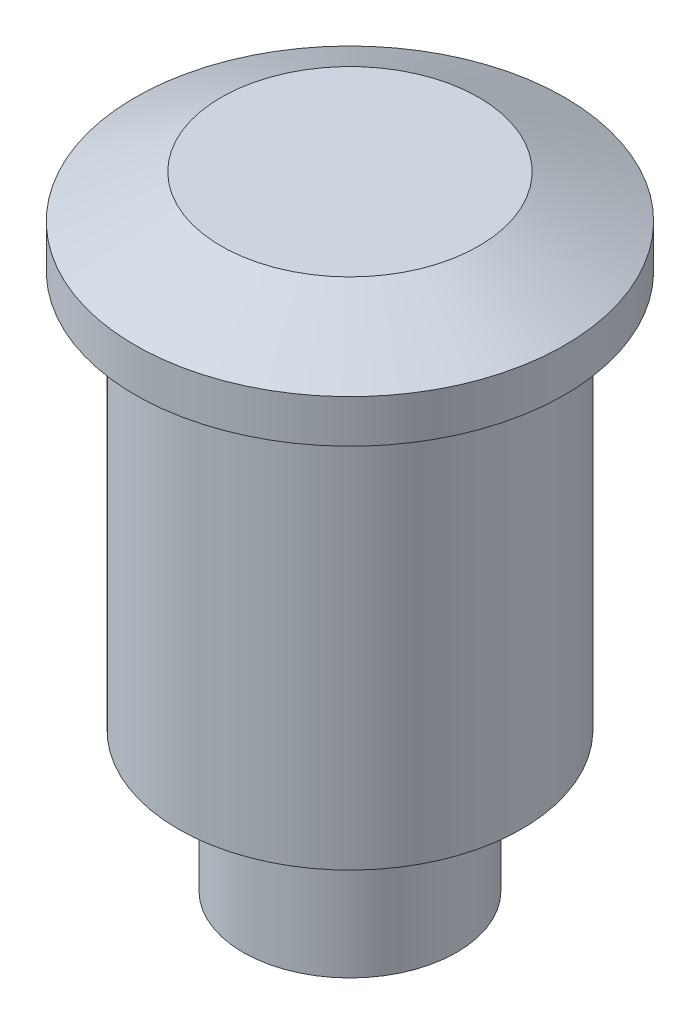
ISO-10303-21;
HEADER;
FILE_DESCRIPTION(('STEP AP214'),'2;1');
FILE_NAME('part.step','',(''),(''),'','','');
FILE_SCHEMA(('AUTOMOTIVE_DESIGN { 1 0 10303 214 1 1 1 1 }'));
ENDSEC;
DATA;
#1=APPLICATION_CONTEXT('core data for automotive mechanical design processes');
#2=APPLICATION_PROTOCOL_DEFINITION('international standard','automotive_design',2000,#1);
#3=PRODUCT_CONTEXT('',#1,'mechanical');
#4=PRODUCT('Part','Part','',(#3));
#5=PRODUCT_RELATED_PRODUCT_CATEGORY('part','',(#4));
#6=PRODUCT_DEFINITION_FORMATION('','',#4);
#7=PRODUCT_DEFINITION_CONTEXT('part definition',#1,'design');
#8=PRODUCT_DEFINITION('design','',#6,#7);
#9=PRODUCT_DEFINITION_SHAPE('','',#8);
#10=(LENGTH_UNIT() NAMED_UNIT(*) SI_UNIT(.MILLI.,.METRE.));
#11=(NAMED_UNIT(*) PLANE_ANGLE_UNIT() SI_UNIT($,.RADIAN.));
#12=(NAMED_UNIT(*) SI_UNIT($,.STERADIAN.) SOLID_ANGLE_UNIT());
#13=UNCERTAINTY_MEASURE_WITH_UNIT(LENGTH_MEASURE(1.E-05),#10,'distance_accuracy_value','');
#14=(GEOMETRIC_REPRESENTATION_CONTEXT(3) GLOBAL_UNCERTAINTY_ASSIGNED_CONTEXT((#13)) GLOBAL_UNIT_ASSIGNED_CONTEXT((#10,
#11,#12)) REPRESENTATION_CONTEXT('',''));
#15=CARTESIAN_POINT('',(0.,0.,0.));
#16=DIRECTION('',(0.,0.,1.));
#17=DIRECTION('',(1.,0.,0.));
#18=AXIS2_PLACEMENT_3D('',#15,#16,#17);
#19=CARTESIAN_POINT('',(0.,59.8199807079985,0.));
#20=DIRECTION('',(0.,1.,0.));
#21=DIRECTION('',(0.,0.,1.));
#22=AXIS2_PLACEMENT_3D('',#19,#20,#21);
#23=PLANE('',#22);
#24=CARTESIAN_POINT('',(0.,59.8199807079985,0.));
#25=DIRECTION('',(0.,-1.,0.));
#26=DIRECTION('',(0.,0.,-1.));
#27=AXIS2_PLACEMENT_3D('',#24,#25,#26);
#28=CIRCLE('',#27,3.);
#29=CARTESIAN_POINT('',(0.,59.8199807079985,-3.));
#30=VERTEX_POINT('',#29);
#31=EDGE_CURVE('E10',#30,#30,#28,.T.);
#32=ORIENTED_EDGE('',*,*,#31,.F.);
#33=EDGE_LOOP('',(#32));
#34=FACE_BOUND('',#33,.T.);
#35=ADVANCED_FACE('F32',(#34),#23,.T.);
#36=CARTESIAN_POINT('',(0.,58.8199807079985,0.));
#37=DIRECTION('',(0.,-1.,0.));
#38=DIRECTION('',(0.,0.,-1.));
#39=AXIS2_PLACEMENT_3D('',#36,#37,#38);
#40=CONICAL_SURFACE('',#39,5.,1.10714871779409);
#41=ORIENTED_EDGE('',*,*,#31,.T.);
#42=EDGE_LOOP('',(#41));
#43=FACE_BOUND('',#42,.T.);
#44=CARTESIAN_POINT('',(0.,58.8199807079985,0.));
#45=DIRECTION('',(0.,-1.,0.));
#46=DIRECTION('',(0.,0.,-1.));
#47=AXIS2_PLACEMENT_3D('',#44,#45,#46);
#48=CIRCLE('',#47,5.);
#49=CARTESIAN_POINT('',(0.,58.8199807079985,-5.));
#50=VERTEX_POINT('',#49);
#51=EDGE_CURVE('E38',#50,#50,#48,.T.);
#52=ORIENTED_EDGE('',*,*,#51,.F.);
#53=EDGE_LOOP('',(#52));
#54=FACE_BOUND('',#53,.T.);
#55=ADVANCED_FACE('F77',(#43,#54),#40,.T.);
#56=CARTESIAN_POINT('',(0.,0.,0.));
#57=DIRECTION('',(0.,-1.,0.));
#58=DIRECTION('',(0.,0.,-1.));
#59=AXIS2_PLACEMENT_3D('',#56,#57,#58);
#60=CYLINDRICAL_SURFACE('',#59,5.);
#61=ORIENTED_EDGE('',*,*,#51,.T.);
#62=EDGE_LOOP('',(#61));
#63=FACE_BOUND('',#62,.T.);
#64=CARTESIAN_POINT('',(0.,57.8199807079985,0.));
#65=DIRECTION('',(0.,-1.,0.));
#66=DIRECTION('',(0.,0.,-1.));
#67=AXIS2_PLACEMENT_3D('',#64,#65,#66);
#68=CIRCLE('',#67,5.);
#69=CARTESIAN_POINT('',(0.,57.8199807079985,-5.));
#70=VERTEX_POINT('',#69);
#71=EDGE_CURVE('E42',#70,#70,#68,.T.);
#72=ORIENTED_EDGE('',*,*,#71,.F.);
#73=EDGE_LOOP('',(#72));
#74=FACE_BOUND('',#73,.T.);
#75=ADVANCED_FACE('F82',(#63,#74),#60,.T.);
#76=CARTESIAN_POINT('',(5.,57.8199807079985,0.));
#77=DIRECTION('',(0.,-1.,0.));
#78=DIRECTION('',(0.,0.,-1.));
#79=AXIS2_PLACEMENT_3D('',#76,#77,#78);
#80=PLANE('',#79);
#81=ORIENTED_EDGE('',*,*,#71,.T.);
#82=EDGE_LOOP('',(#81));
#83=FACE_BOUND('',#82,.T.);
#84=CARTESIAN_POINT('',(0.,57.8199807079985,0.));
#85=DIRECTION('',(0.,-1.,0.));
#86=DIRECTION('',(0.,0.,-1.));
#87=AXIS2_PLACEMENT_3D('',#84,#85,#86);
#88=CIRCLE('',#87,4.);
#89=CARTESIAN_POINT('',(0.,57.8199807079985,-4.));
#90=VERTEX_POINT('',#89);
#91=EDGE_CURVE('E46',#90,#90,#88,.T.);
#92=ORIENTED_EDGE('',*,*,#91,.F.);
#93=EDGE_LOOP('',(#92));
#94=FACE_BOUND('',#93,.T.);
#95=ADVANCED_FACE('F86',(#83,#94),#80,.T.);
#96=CARTESIAN_POINT('',(0.,0.,0.));
#97=DIRECTION('',(0.,-1.,0.));
#98=DIRECTION('',(0.,0.,-1.));
#99=AXIS2_PLACEMENT_3D('',#96,#97,#98);
#100=CYLINDRICAL_SURFACE('',#99,4.);
#101=ORIENTED_EDGE('',*,*,#91,.T.);
#102=EDGE_LOOP('',(#101));
#103=FACE_BOUND('',#102,.T.);
#104=CARTESIAN_POINT('',(0.,48.5654918052969,0.));
#105=DIRECTION('',(0.,-1.,0.));
#106=DIRECTION('',(0.,0.,-1.));
#107=AXIS2_PLACEMENT_3D('',#104,#105,#106);
#108=CIRCLE('',#107,4.);
#109=CARTESIAN_POINT('',(0.,48.5654918052969,-4.));
#110=VERTEX_POINT('',#109);
#111=EDGE_CURVE('E51',#110,#110,#108,.T.);
#112=ORIENTED_EDGE('',*,*,#111,.F.);
#113=EDGE_LOOP('',(#112));
#114=FACE_BOUND('',#113,.T.);
#115=ADVANCED_FACE('F73',(#103,#114),#100,.T.);
#116=CARTESIAN_POINT('',(4.,48.5654918052969,0.));
#117=DIRECTION('',(0.,-1.,0.));
#118=DIRECTION('',(0.,0.,-1.));
#119=AXIS2_PLACEMENT_3D('',#116,#117,#118);
#120=PLANE('',#119);
#121=ORIENTED_EDGE('',*,*,#111,.T.);
#122=EDGE_LOOP('',(#121));
#123=FACE_BOUND('',#122,.T.);
#124=CARTESIAN_POINT('',(0.,48.5654918052969,0.));
#125=DIRECTION('',(0.,-1.,0.));
#126=DIRECTION('',(0.,0.,-1.));
#127=AXIS2_PLACEMENT_3D('',#124,#125,#126);
#128=CIRCLE('',#127,2.48595167378136);
#129=CARTESIAN_POINT('',(0.,48.5654918052969,-2.48595167378136));
#130=VERTEX_POINT('',#129);
#131=EDGE_CURVE('E54',#130,#130,#128,.T.);
#132=ORIENTED_EDGE('',*,*,#131,.F.);
#133=EDGE_LOOP('',(#132));
#134=FACE_BOUND('',#133,.T.);
#135=ADVANCED_FACE('F65',(#123,#134),#120,.T.);
#136=CARTESIAN_POINT('',(0.,0.,0.));
#137=DIRECTION('',(0.,-1.,0.));
#138=DIRECTION('',(0.,0.,-1.));
#139=AXIS2_PLACEMENT_3D('',#136,#137,#138);
#140=CYLINDRICAL_SURFACE('',#139,2.48595167378136);
#141=ORIENTED_EDGE('',*,*,#131,.T.);
#142=EDGE_LOOP('',(#141));
#143=FACE_BOUND('',#142,.T.);
#144=CARTESIAN_POINT('',(0.,45.3199807079985,0.));
#145=DIRECTION('',(0.,-1.,0.));
#146=DIRECTION('',(0.,0.,-1.));
#147=AXIS2_PLACEMENT_3D('',#144,#145,#146);
#148=CIRCLE('',#147,2.48595167378137);
#149=CARTESIAN_POINT('',(0.,45.3199807079985,-2.48595167378137));
#150=VERTEX_POINT('',#149);
#151=EDGE_CURVE('E57',#150,#150,#148,.T.);
#152=ORIENTED_EDGE('',*,*,#151,.F.);
#153=EDGE_LOOP('',(#152));
#154=FACE_BOUND('',#153,.T.);
#155=ADVANCED_FACE('F63',(#143,#154),#140,.T.);
#156=CARTESIAN_POINT('',(2.48595167378137,45.3199807079985,0.));
#157=DIRECTION('',(0.,-1.,0.));
#158=DIRECTION('',(0.,0.,-1.));
#159=AXIS2_PLACEMENT_3D('',#156,#157,#158);
#160=PLANE('',#159);
#161=ORIENTED_EDGE('',*,*,#151,.T.);
#162=EDGE_LOOP('',(#161));
#163=FACE_BOUND('',#162,.T.);
#164=ADVANCED_FACE('F61',(#163),#160,.T.);
#165=CLOSED_SHELL('',(#35,#55,#75,#95,#115,#135,#155,#164));
#166=MANIFOLD_SOLID_BREP('B2',#165);
#167=ADVANCED_BREP_SHAPE_REPRESENTATION('',(#18,#166),#14);
#168=SHAPE_DEFINITION_REPRESENTATION(#9,#167);
ENDSEC;
END-ISO-10303-21;
